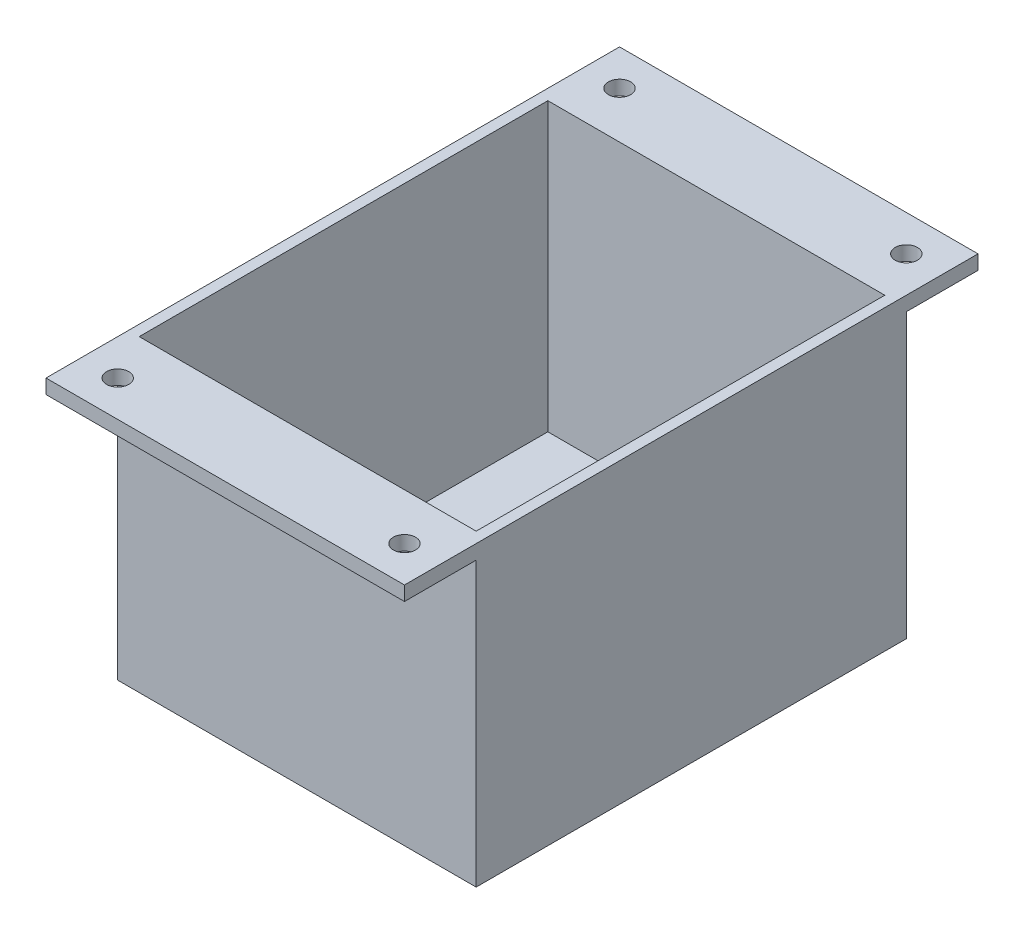
ISO-10303-21;
HEADER;
FILE_DESCRIPTION(('STEP AP214'),'2;1');
FILE_NAME('part.step','',(''),(''),'','','');
FILE_SCHEMA(('AUTOMOTIVE_DESIGN { 1 0 10303 214 1 1 1 1 }'));
ENDSEC;
DATA;
#1=APPLICATION_CONTEXT('core data for automotive mechanical design processes');
#2=APPLICATION_PROTOCOL_DEFINITION('international standard','automotive_design',2000,#1);
#3=PRODUCT_CONTEXT('',#1,'mechanical');
#4=PRODUCT('Part','Part','',(#3));
#5=PRODUCT_RELATED_PRODUCT_CATEGORY('part','',(#4));
#6=PRODUCT_DEFINITION_FORMATION('','',#4);
#7=PRODUCT_DEFINITION_CONTEXT('part definition',#1,'design');
#8=PRODUCT_DEFINITION('design','',#6,#7);
#9=PRODUCT_DEFINITION_SHAPE('','',#8);
#10=(LENGTH_UNIT() NAMED_UNIT(*) SI_UNIT(.MILLI.,.METRE.));
#11=(NAMED_UNIT(*) PLANE_ANGLE_UNIT() SI_UNIT($,.RADIAN.));
#12=(NAMED_UNIT(*) SI_UNIT($,.STERADIAN.) SOLID_ANGLE_UNIT());
#13=UNCERTAINTY_MEASURE_WITH_UNIT(LENGTH_MEASURE(1.E-05),#10,'distance_accuracy_value','');
#14=(GEOMETRIC_REPRESENTATION_CONTEXT(3) GLOBAL_UNCERTAINTY_ASSIGNED_CONTEXT((#13)) GLOBAL_UNIT_ASSIGNED_CONTEXT((#10,
#11,#12)) REPRESENTATION_CONTEXT('',''));
#15=CARTESIAN_POINT('',(0.,0.,0.));
#16=DIRECTION('',(0.,0.,1.));
#17=DIRECTION('',(1.,0.,0.));
#18=AXIS2_PLACEMENT_3D('',#15,#16,#17);
#19=CARTESIAN_POINT('',(0.,40.,-30.));
#20=DIRECTION('',(0.,0.,-1.));
#21=DIRECTION('',(-1.,0.,0.));
#22=AXIS2_PLACEMENT_3D('',#19,#20,#21);
#23=PLANE('',#22);
#24=DIRECTION('',(0.,-1.,0.));
#25=VECTOR('',#24,1.);
#26=CARTESIAN_POINT('',(-25.,40.,-30.));
#27=LINE('',#26,#25);
#28=CARTESIAN_POINT('',(-25.,38.,-30.));
#29=VERTEX_POINT('',#28);
#30=CARTESIAN_POINT('',(-25.,-1.5,-30.));
#31=VERTEX_POINT('',#30);
#32=EDGE_CURVE('E11',#29,#31,#27,.T.);
#33=ORIENTED_EDGE('',*,*,#32,.F.);
#34=DIRECTION('',(1.,0.,0.));
#35=VECTOR('',#34,1.);
#36=CARTESIAN_POINT('',(-25.,38.,-30.));
#37=LINE('',#36,#35);
#38=CARTESIAN_POINT('',(25.,38.,-30.));
#39=VERTEX_POINT('',#38);
#40=EDGE_CURVE('E176',#29,#39,#37,.T.);
#41=ORIENTED_EDGE('',*,*,#40,.T.);
#42=DIRECTION('',(0.,-1.,0.));
#43=VECTOR('',#42,1.);
#44=CARTESIAN_POINT('',(25.,40.,-30.));
#45=LINE('',#44,#43);
#46=CARTESIAN_POINT('',(25.,-1.5,-30.));
#47=VERTEX_POINT('',#46);
#48=EDGE_CURVE('E246',#39,#47,#45,.T.);
#49=ORIENTED_EDGE('',*,*,#48,.T.);
#50=DIRECTION('',(1.,0.,0.));
#51=VECTOR('',#50,1.);
#52=CARTESIAN_POINT('',(-25.,-1.5,-30.));
#53=LINE('',#52,#51);
#54=EDGE_CURVE('E203',#31,#47,#53,.T.);
#55=ORIENTED_EDGE('',*,*,#54,.F.);
#56=EDGE_LOOP('',(#33,#41,#49,#55));
#57=FACE_BOUND('',#56,.T.);
#58=ADVANCED_FACE('F47',(#57),#23,.T.);
#59=CARTESIAN_POINT('',(0.,40.,30.));
#60=DIRECTION('',(0.,0.,-1.));
#61=DIRECTION('',(-1.,0.,0.));
#62=AXIS2_PLACEMENT_3D('',#59,#60,#61);
#63=PLANE('',#62);
#64=DIRECTION('',(1.,0.,0.));
#65=VECTOR('',#64,1.);
#66=CARTESIAN_POINT('',(-25.,38.,30.));
#67=LINE('',#66,#65);
#68=CARTESIAN_POINT('',(-25.,38.,30.));
#69=VERTEX_POINT('',#68);
#70=CARTESIAN_POINT('',(25.,38.,30.));
#71=VERTEX_POINT('',#70);
#72=EDGE_CURVE('E73',#69,#71,#67,.T.);
#73=ORIENTED_EDGE('',*,*,#72,.F.);
#74=DIRECTION('',(0.,-1.,0.));
#75=VECTOR('',#74,1.);
#76=CARTESIAN_POINT('',(-25.,40.,30.));
#77=LINE('',#76,#75);
#78=CARTESIAN_POINT('',(-25.,-1.5,30.));
#79=VERTEX_POINT('',#78);
#80=EDGE_CURVE('E57',#69,#79,#77,.T.);
#81=ORIENTED_EDGE('',*,*,#80,.T.);
#82=DIRECTION('',(-1.,0.,0.));
#83=VECTOR('',#82,1.);
#84=CARTESIAN_POINT('',(-25.,-1.5,30.));
#85=LINE('',#84,#83);
#86=CARTESIAN_POINT('',(25.,-1.5,30.));
#87=VERTEX_POINT('',#86);
#88=EDGE_CURVE('E211',#87,#79,#85,.T.);
#89=ORIENTED_EDGE('',*,*,#88,.F.);
#90=DIRECTION('',(0.,-1.,0.));
#91=VECTOR('',#90,1.);
#92=CARTESIAN_POINT('',(25.,40.,30.));
#93=LINE('',#92,#91);
#94=EDGE_CURVE('E249',#71,#87,#93,.T.);
#95=ORIENTED_EDGE('',*,*,#94,.F.);
#96=EDGE_LOOP('',(#73,#81,#89,#95));
#97=FACE_BOUND('',#96,.T.);
#98=ADVANCED_FACE('F303',(#97),#63,.F.);
#99=CARTESIAN_POINT('',(-25.,40.,0.));
#100=DIRECTION('',(-1.,0.,0.));
#101=DIRECTION('',(0.,0.,1.));
#102=AXIS2_PLACEMENT_3D('',#99,#100,#101);
#103=PLANE('',#102);
#104=DIRECTION('',(0.,0.,-1.));
#105=VECTOR('',#104,1.);
#106=CARTESIAN_POINT('',(-25.,40.,0.));
#107=LINE('',#106,#105);
#108=CARTESIAN_POINT('',(-25.,40.,40.));
#109=VERTEX_POINT('',#108);
#110=CARTESIAN_POINT('',(-25.,40.,-40.));
#111=VERTEX_POINT('',#110);
#112=EDGE_CURVE('E151',#109,#111,#107,.T.);
#113=ORIENTED_EDGE('',*,*,#112,.T.);
#114=DIRECTION('',(0.,1.,0.));
#115=VECTOR('',#114,1.);
#116=CARTESIAN_POINT('',(-25.,40.,-40.));
#117=LINE('',#116,#115);
#118=CARTESIAN_POINT('',(-25.,38.,-40.));
#119=VERTEX_POINT('',#118);
#120=EDGE_CURVE('E158',#119,#111,#117,.T.);
#121=ORIENTED_EDGE('',*,*,#120,.F.);
#122=DIRECTION('',(0.,0.,-1.));
#123=VECTOR('',#122,1.);
#124=CARTESIAN_POINT('',(-25.,38.,-30.));
#125=LINE('',#124,#123);
#126=EDGE_CURVE('E165',#29,#119,#125,.T.);
#127=ORIENTED_EDGE('',*,*,#126,.F.);
#128=ORIENTED_EDGE('',*,*,#32,.T.);
#129=DIRECTION('',(0.,0.,-1.));
#130=VECTOR('',#129,1.);
#131=CARTESIAN_POINT('',(-25.,-1.5,30.));
#132=LINE('',#131,#130);
#133=EDGE_CURVE('E194',#79,#31,#132,.T.);
#134=ORIENTED_EDGE('',*,*,#133,.F.);
#135=ORIENTED_EDGE('',*,*,#80,.F.);
#136=DIRECTION('',(0.,0.,-1.));
#137=VECTOR('',#136,1.);
#138=CARTESIAN_POINT('',(-25.,38.,30.));
#139=LINE('',#138,#137);
#140=CARTESIAN_POINT('',(-25.,38.,40.));
#141=VERTEX_POINT('',#140);
#142=EDGE_CURVE('E182',#141,#69,#139,.T.);
#143=ORIENTED_EDGE('',*,*,#142,.F.);
#144=DIRECTION('',(0.,-1.,0.));
#145=VECTOR('',#144,1.);
#146=CARTESIAN_POINT('',(-25.,40.,40.));
#147=LINE('',#146,#145);
#148=EDGE_CURVE('E178',#109,#141,#147,.T.);
#149=ORIENTED_EDGE('',*,*,#148,.F.);
#150=EDGE_LOOP('',(#113,#121,#127,#128,#134,#135,#143,#149));
#151=FACE_BOUND('',#150,.T.);
#152=ADVANCED_FACE('F300',(#151),#103,.T.);
#153=CARTESIAN_POINT('',(23.5,40.,0.));
#154=DIRECTION('',(-1.,0.,0.));
#155=DIRECTION('',(0.,0.,1.));
#156=AXIS2_PLACEMENT_3D('',#153,#154,#155);
#157=PLANE('',#156);
#158=DIRECTION('',(0.,0.,-1.));
#159=VECTOR('',#158,1.);
#160=CARTESIAN_POINT('',(23.5,0.,0.));
#161=LINE('',#160,#159);
#162=CARTESIAN_POINT('',(23.5,0.,28.5));
#163=VERTEX_POINT('',#162);
#164=CARTESIAN_POINT('',(23.5,0.,-28.5));
#165=VERTEX_POINT('',#164);
#166=EDGE_CURVE('E215',#163,#165,#161,.T.);
#167=ORIENTED_EDGE('',*,*,#166,.F.);
#168=DIRECTION('',(0.,-1.,0.));
#169=VECTOR('',#168,1.);
#170=CARTESIAN_POINT('',(23.5,40.,28.5));
#171=LINE('',#170,#169);
#172=CARTESIAN_POINT('',(23.5,40.,28.5));
#173=VERTEX_POINT('',#172);
#174=EDGE_CURVE('E250',#173,#163,#171,.T.);
#175=ORIENTED_EDGE('',*,*,#174,.F.);
#176=DIRECTION('',(0.,0.,-1.));
#177=VECTOR('',#176,1.);
#178=CARTESIAN_POINT('',(23.5,40.,0.));
#179=LINE('',#178,#177);
#180=CARTESIAN_POINT('',(23.5,40.,-28.5));
#181=VERTEX_POINT('',#180);
#182=EDGE_CURVE('E216',#173,#181,#179,.T.);
#183=ORIENTED_EDGE('',*,*,#182,.T.);
#184=DIRECTION('',(0.,-1.,0.));
#185=VECTOR('',#184,1.);
#186=CARTESIAN_POINT('',(23.5,40.,-28.5));
#187=LINE('',#186,#185);
#188=EDGE_CURVE('E150',#181,#165,#187,.T.);
#189=ORIENTED_EDGE('',*,*,#188,.T.);
#190=EDGE_LOOP('',(#167,#175,#183,#189));
#191=FACE_BOUND('',#190,.T.);
#192=ADVANCED_FACE('F49',(#191),#157,.T.);
#193=CARTESIAN_POINT('',(0.,40.,28.5));
#194=DIRECTION('',(0.,0.,-1.));
#195=DIRECTION('',(-1.,0.,0.));
#196=AXIS2_PLACEMENT_3D('',#193,#194,#195);
#197=PLANE('',#196);
#198=DIRECTION('',(1.,0.,0.));
#199=VECTOR('',#198,1.);
#200=CARTESIAN_POINT('',(0.,0.,28.5));
#201=LINE('',#200,#199);
#202=CARTESIAN_POINT('',(-23.5,0.,28.5));
#203=VERTEX_POINT('',#202);
#204=EDGE_CURVE('E236',#203,#163,#201,.T.);
#205=ORIENTED_EDGE('',*,*,#204,.F.);
#206=DIRECTION('',(0.,-1.,0.));
#207=VECTOR('',#206,1.);
#208=CARTESIAN_POINT('',(-23.5,40.,28.5));
#209=LINE('',#208,#207);
#210=CARTESIAN_POINT('',(-23.5,40.,28.5));
#211=VERTEX_POINT('',#210);
#212=EDGE_CURVE('E261',#211,#203,#209,.T.);
#213=ORIENTED_EDGE('',*,*,#212,.F.);
#214=DIRECTION('',(1.,0.,0.));
#215=VECTOR('',#214,1.);
#216=CARTESIAN_POINT('',(0.,40.,28.5));
#217=LINE('',#216,#215);
#218=EDGE_CURVE('E220',#211,#173,#217,.T.);
#219=ORIENTED_EDGE('',*,*,#218,.T.);
#220=ORIENTED_EDGE('',*,*,#174,.T.);
#221=EDGE_LOOP('',(#205,#213,#219,#220));
#222=FACE_BOUND('',#221,.T.);
#223=ADVANCED_FACE('F345',(#222),#197,.T.);
#224=CARTESIAN_POINT('',(-23.5,40.,0.));
#225=DIRECTION('',(-1.,0.,0.));
#226=DIRECTION('',(0.,0.,1.));
#227=AXIS2_PLACEMENT_3D('',#224,#225,#226);
#228=PLANE('',#227);
#229=DIRECTION('',(0.,0.,-1.));
#230=VECTOR('',#229,1.);
#231=CARTESIAN_POINT('',(-23.5,0.,0.));
#232=LINE('',#231,#230);
#233=CARTESIAN_POINT('',(-23.5,0.,-28.5));
#234=VERTEX_POINT('',#233);
#235=EDGE_CURVE('E240',#203,#234,#232,.T.);
#236=ORIENTED_EDGE('',*,*,#235,.T.);
#237=DIRECTION('',(0.,-1.,0.));
#238=VECTOR('',#237,1.);
#239=CARTESIAN_POINT('',(-23.5,40.,-28.5));
#240=LINE('',#239,#238);
#241=CARTESIAN_POINT('',(-23.5,40.,-28.5));
#242=VERTEX_POINT('',#241);
#243=EDGE_CURVE('E257',#242,#234,#240,.T.);
#244=ORIENTED_EDGE('',*,*,#243,.F.);
#245=DIRECTION('',(0.,0.,-1.));
#246=VECTOR('',#245,1.);
#247=CARTESIAN_POINT('',(-23.5,40.,0.));
#248=LINE('',#247,#246);
#249=EDGE_CURVE('E225',#211,#242,#248,.T.);
#250=ORIENTED_EDGE('',*,*,#249,.F.);
#251=ORIENTED_EDGE('',*,*,#212,.T.);
#252=EDGE_LOOP('',(#236,#244,#250,#251));
#253=FACE_BOUND('',#252,.T.);
#254=ADVANCED_FACE('F350',(#253),#228,.F.);
#255=CARTESIAN_POINT('',(0.,40.,-28.5));
#256=DIRECTION('',(0.,0.,-1.));
#257=DIRECTION('',(-1.,0.,0.));
#258=AXIS2_PLACEMENT_3D('',#255,#256,#257);
#259=PLANE('',#258);
#260=DIRECTION('',(1.,0.,0.));
#261=VECTOR('',#260,1.);
#262=CARTESIAN_POINT('',(0.,0.,-28.5));
#263=LINE('',#262,#261);
#264=EDGE_CURVE('E221',#234,#165,#263,.T.);
#265=ORIENTED_EDGE('',*,*,#264,.T.);
#266=ORIENTED_EDGE('',*,*,#188,.F.);
#267=DIRECTION('',(1.,0.,0.));
#268=VECTOR('',#267,1.);
#269=CARTESIAN_POINT('',(0.,40.,-28.5));
#270=LINE('',#269,#268);
#271=EDGE_CURVE('E228',#242,#181,#270,.T.);
#272=ORIENTED_EDGE('',*,*,#271,.F.);
#273=ORIENTED_EDGE('',*,*,#243,.T.);
#274=EDGE_LOOP('',(#265,#266,#272,#273));
#275=FACE_BOUND('',#274,.T.);
#276=ADVANCED_FACE('F353',(#275),#259,.F.);
#277=CARTESIAN_POINT('',(25.,40.,0.));
#278=DIRECTION('',(-1.,0.,0.));
#279=DIRECTION('',(0.,0.,1.));
#280=AXIS2_PLACEMENT_3D('',#277,#278,#279);
#281=PLANE('',#280);
#282=DIRECTION('',(0.,0.,-1.));
#283=VECTOR('',#282,1.);
#284=CARTESIAN_POINT('',(25.,40.,0.));
#285=LINE('',#284,#283);
#286=CARTESIAN_POINT('',(25.,40.,40.));
#287=VERTEX_POINT('',#286);
#288=CARTESIAN_POINT('',(25.,40.,-40.));
#289=VERTEX_POINT('',#288);
#290=EDGE_CURVE('E138',#287,#289,#285,.T.);
#291=ORIENTED_EDGE('',*,*,#290,.F.);
#292=DIRECTION('',(0.,-1.,0.));
#293=VECTOR('',#292,1.);
#294=CARTESIAN_POINT('',(25.,40.,40.));
#295=LINE('',#294,#293);
#296=CARTESIAN_POINT('',(25.,38.,40.));
#297=VERTEX_POINT('',#296);
#298=EDGE_CURVE('E169',#287,#297,#295,.T.);
#299=ORIENTED_EDGE('',*,*,#298,.T.);
#300=DIRECTION('',(0.,0.,-1.));
#301=VECTOR('',#300,1.);
#302=CARTESIAN_POINT('',(25.,38.,30.));
#303=LINE('',#302,#301);
#304=EDGE_CURVE('E183',#297,#71,#303,.T.);
#305=ORIENTED_EDGE('',*,*,#304,.T.);
#306=ORIENTED_EDGE('',*,*,#94,.T.);
#307=DIRECTION('',(0.,0.,1.));
#308=VECTOR('',#307,1.);
#309=CARTESIAN_POINT('',(25.,-1.5,30.));
#310=LINE('',#309,#308);
#311=EDGE_CURVE('E207',#47,#87,#310,.T.);
#312=ORIENTED_EDGE('',*,*,#311,.F.);
#313=ORIENTED_EDGE('',*,*,#48,.F.);
#314=DIRECTION('',(0.,0.,-1.));
#315=VECTOR('',#314,1.);
#316=CARTESIAN_POINT('',(25.,38.,-30.));
#317=LINE('',#316,#315);
#318=CARTESIAN_POINT('',(25.,38.,-40.));
#319=VERTEX_POINT('',#318);
#320=EDGE_CURVE('E65',#39,#319,#317,.T.);
#321=ORIENTED_EDGE('',*,*,#320,.T.);
#322=DIRECTION('',(0.,1.,0.));
#323=VECTOR('',#322,1.);
#324=CARTESIAN_POINT('',(25.,40.,-40.));
#325=LINE('',#324,#323);
#326=EDGE_CURVE('E156',#319,#289,#325,.T.);
#327=ORIENTED_EDGE('',*,*,#326,.T.);
#328=EDGE_LOOP('',(#291,#299,#305,#306,#312,#313,#321,#327));
#329=FACE_BOUND('',#328,.T.);
#330=ADVANCED_FACE('F162',(#329),#281,.F.);
#331=CARTESIAN_POINT('',(0.,40.,0.));
#332=DIRECTION('',(0.,1.,0.));
#333=DIRECTION('',(0.,0.,1.));
#334=AXIS2_PLACEMENT_3D('',#331,#332,#333);
#335=PLANE('',#334);
#336=CARTESIAN_POINT('',(-20.,40.,35.));
#337=DIRECTION('',(0.,1.,0.));
#338=DIRECTION('',(0.,0.,1.));
#339=AXIS2_PLACEMENT_3D('',#336,#337,#338);
#340=CIRCLE('',#339,1.55);
#341=CARTESIAN_POINT('',(-20.,40.,36.55));
#342=VERTEX_POINT('',#341);
#343=EDGE_CURVE('E317',#342,#342,#340,.T.);
#344=ORIENTED_EDGE('',*,*,#343,.F.);
#345=EDGE_LOOP('',(#344));
#346=FACE_BOUND('',#345,.T.);
#347=CARTESIAN_POINT('',(20.,40.,35.));
#348=DIRECTION('',(0.,1.,0.));
#349=DIRECTION('',(0.,0.,1.));
#350=AXIS2_PLACEMENT_3D('',#347,#348,#349);
#351=CIRCLE('',#350,1.55);
#352=CARTESIAN_POINT('',(20.,40.,36.55));
#353=VERTEX_POINT('',#352);
#354=EDGE_CURVE('E321',#353,#353,#351,.T.);
#355=ORIENTED_EDGE('',*,*,#354,.F.);
#356=EDGE_LOOP('',(#355));
#357=FACE_BOUND('',#356,.T.);
#358=CARTESIAN_POINT('',(20.,40.,-35.));
#359=DIRECTION('',(0.,1.,0.));
#360=DIRECTION('',(0.,0.,1.));
#361=AXIS2_PLACEMENT_3D('',#358,#359,#360);
#362=CIRCLE('',#361,1.55);
#363=CARTESIAN_POINT('',(20.,40.,-33.45));
#364=VERTEX_POINT('',#363);
#365=EDGE_CURVE('E316',#364,#364,#362,.T.);
#366=ORIENTED_EDGE('',*,*,#365,.F.);
#367=EDGE_LOOP('',(#366));
#368=FACE_BOUND('',#367,.T.);
#369=CARTESIAN_POINT('',(-20.,40.,-35.));
#370=DIRECTION('',(0.,1.,0.));
#371=DIRECTION('',(0.,0.,1.));
#372=AXIS2_PLACEMENT_3D('',#369,#370,#371);
#373=CIRCLE('',#372,1.55);
#374=CARTESIAN_POINT('',(-20.,40.,-33.45));
#375=VERTEX_POINT('',#374);
#376=EDGE_CURVE('E272',#375,#375,#373,.T.);
#377=ORIENTED_EDGE('',*,*,#376,.F.);
#378=EDGE_LOOP('',(#377));
#379=FACE_BOUND('',#378,.T.);
#380=ORIENTED_EDGE('',*,*,#182,.F.);
#381=ORIENTED_EDGE('',*,*,#218,.F.);
#382=ORIENTED_EDGE('',*,*,#249,.T.);
#383=ORIENTED_EDGE('',*,*,#271,.T.);
#384=EDGE_LOOP('',(#380,#381,#382,#383));
#385=FACE_BOUND('',#384,.T.);
#386=ORIENTED_EDGE('',*,*,#290,.T.);
#387=DIRECTION('',(1.,0.,0.));
#388=VECTOR('',#387,1.);
#389=CARTESIAN_POINT('',(-25.,40.,-40.));
#390=LINE('',#389,#388);
#391=EDGE_CURVE('E141',#111,#289,#390,.T.);
#392=ORIENTED_EDGE('',*,*,#391,.F.);
#393=ORIENTED_EDGE('',*,*,#112,.F.);
#394=DIRECTION('',(1.,0.,0.));
#395=VECTOR('',#394,1.);
#396=CARTESIAN_POINT('',(-25.,40.,40.));
#397=LINE('',#396,#395);
#398=EDGE_CURVE('E144',#109,#287,#397,.T.);
#399=ORIENTED_EDGE('',*,*,#398,.T.);
#400=EDGE_LOOP('',(#386,#392,#393,#399));
#401=FACE_BOUND('',#400,.T.);
#402=ADVANCED_FACE('F140',(#346,#357,#368,#379,#385,#401),#335,.T.);
#403=CARTESIAN_POINT('',(0.,0.,0.));
#404=DIRECTION('',(0.,-1.,0.));
#405=DIRECTION('',(0.,0.,-1.));
#406=AXIS2_PLACEMENT_3D('',#403,#404,#405);
#407=PLANE('',#406);
#408=ORIENTED_EDGE('',*,*,#204,.T.);
#409=ORIENTED_EDGE('',*,*,#166,.T.);
#410=ORIENTED_EDGE('',*,*,#264,.F.);
#411=ORIENTED_EDGE('',*,*,#235,.F.);
#412=EDGE_LOOP('',(#408,#409,#410,#411));
#413=FACE_BOUND('',#412,.T.);
#414=ADVANCED_FACE('F333',(#413),#407,.F.);
#415=CARTESIAN_POINT('',(0.,-1.5,0.));
#416=DIRECTION('',(0.,-1.,0.));
#417=DIRECTION('',(0.,0.,-1.));
#418=AXIS2_PLACEMENT_3D('',#415,#416,#417);
#419=PLANE('',#418);
#420=ORIENTED_EDGE('',*,*,#133,.T.);
#421=ORIENTED_EDGE('',*,*,#54,.T.);
#422=ORIENTED_EDGE('',*,*,#311,.T.);
#423=ORIENTED_EDGE('',*,*,#88,.T.);
#424=EDGE_LOOP('',(#420,#421,#422,#423));
#425=FACE_BOUND('',#424,.T.);
#426=ADVANCED_FACE('F291',(#425),#419,.T.);
#427=CARTESIAN_POINT('',(-25.,38.,30.));
#428=DIRECTION('',(0.,-1.,0.));
#429=DIRECTION('',(0.,0.,-1.));
#430=AXIS2_PLACEMENT_3D('',#427,#428,#429);
#431=PLANE('',#430);
#432=CARTESIAN_POINT('',(-20.,38.,35.));
#433=DIRECTION('',(0.,-1.,0.));
#434=DIRECTION('',(0.,0.,-1.));
#435=AXIS2_PLACEMENT_3D('',#432,#433,#434);
#436=CIRCLE('',#435,1.55);
#437=CARTESIAN_POINT('',(-20.,38.,33.45));
#438=VERTEX_POINT('',#437);
#439=EDGE_CURVE('E51',#438,#438,#436,.T.);
#440=ORIENTED_EDGE('',*,*,#439,.F.);
#441=EDGE_LOOP('',(#440));
#442=FACE_BOUND('',#441,.T.);
#443=CARTESIAN_POINT('',(20.,38.,35.));
#444=DIRECTION('',(0.,-1.,0.));
#445=DIRECTION('',(0.,0.,-1.));
#446=AXIS2_PLACEMENT_3D('',#443,#444,#445);
#447=CIRCLE('',#446,1.55);
#448=CARTESIAN_POINT('',(20.,38.,33.45));
#449=VERTEX_POINT('',#448);
#450=EDGE_CURVE('E275',#449,#449,#447,.T.);
#451=ORIENTED_EDGE('',*,*,#450,.F.);
#452=EDGE_LOOP('',(#451));
#453=FACE_BOUND('',#452,.T.);
#454=ORIENTED_EDGE('',*,*,#304,.F.);
#455=DIRECTION('',(1.,0.,0.));
#456=VECTOR('',#455,1.);
#457=CARTESIAN_POINT('',(-25.,38.,40.));
#458=LINE('',#457,#456);
#459=EDGE_CURVE('E195',#141,#297,#458,.T.);
#460=ORIENTED_EDGE('',*,*,#459,.F.);
#461=ORIENTED_EDGE('',*,*,#142,.T.);
#462=ORIENTED_EDGE('',*,*,#72,.T.);
#463=EDGE_LOOP('',(#454,#460,#461,#462));
#464=FACE_BOUND('',#463,.T.);
#465=ADVANCED_FACE('F287',(#442,#453,#464),#431,.T.);
#466=CARTESIAN_POINT('',(-25.,40.,40.));
#467=DIRECTION('',(0.,0.,1.));
#468=DIRECTION('',(1.,0.,0.));
#469=AXIS2_PLACEMENT_3D('',#466,#467,#468);
#470=PLANE('',#469);
#471=ORIENTED_EDGE('',*,*,#298,.F.);
#472=ORIENTED_EDGE('',*,*,#398,.F.);
#473=ORIENTED_EDGE('',*,*,#148,.T.);
#474=ORIENTED_EDGE('',*,*,#459,.T.);
#475=EDGE_LOOP('',(#471,#472,#473,#474));
#476=FACE_BOUND('',#475,.T.);
#477=ADVANCED_FACE('F290',(#476),#470,.T.);
#478=CARTESIAN_POINT('',(-25.,40.,-40.));
#479=DIRECTION('',(0.,0.,-1.));
#480=DIRECTION('',(-1.,0.,0.));
#481=AXIS2_PLACEMENT_3D('',#478,#479,#480);
#482=PLANE('',#481);
#483=ORIENTED_EDGE('',*,*,#326,.F.);
#484=DIRECTION('',(1.,0.,0.));
#485=VECTOR('',#484,1.);
#486=CARTESIAN_POINT('',(-25.,38.,-40.));
#487=LINE('',#486,#485);
#488=EDGE_CURVE('E160',#119,#319,#487,.T.);
#489=ORIENTED_EDGE('',*,*,#488,.F.);
#490=ORIENTED_EDGE('',*,*,#120,.T.);
#491=ORIENTED_EDGE('',*,*,#391,.T.);
#492=EDGE_LOOP('',(#483,#489,#490,#491));
#493=FACE_BOUND('',#492,.T.);
#494=ADVANCED_FACE('F155',(#493),#482,.T.);
#495=CARTESIAN_POINT('',(-25.,38.,-30.));
#496=DIRECTION('',(0.,-1.,0.));
#497=DIRECTION('',(0.,0.,-1.));
#498=AXIS2_PLACEMENT_3D('',#495,#496,#497);
#499=PLANE('',#498);
#500=CARTESIAN_POINT('',(20.,38.,-35.));
#501=DIRECTION('',(0.,-1.,0.));
#502=DIRECTION('',(0.,0.,-1.));
#503=AXIS2_PLACEMENT_3D('',#500,#501,#502);
#504=CIRCLE('',#503,1.55);
#505=CARTESIAN_POINT('',(20.,38.,-36.55));
#506=VERTEX_POINT('',#505);
#507=EDGE_CURVE('E271',#506,#506,#504,.T.);
#508=ORIENTED_EDGE('',*,*,#507,.F.);
#509=EDGE_LOOP('',(#508));
#510=FACE_BOUND('',#509,.T.);
#511=CARTESIAN_POINT('',(-20.,38.,-35.));
#512=DIRECTION('',(0.,-1.,0.));
#513=DIRECTION('',(0.,0.,-1.));
#514=AXIS2_PLACEMENT_3D('',#511,#512,#513);
#515=CIRCLE('',#514,1.55);
#516=CARTESIAN_POINT('',(-20.,38.,-36.55));
#517=VERTEX_POINT('',#516);
#518=EDGE_CURVE('E267',#517,#517,#515,.T.);
#519=ORIENTED_EDGE('',*,*,#518,.F.);
#520=EDGE_LOOP('',(#519));
#521=FACE_BOUND('',#520,.T.);
#522=ORIENTED_EDGE('',*,*,#320,.F.);
#523=ORIENTED_EDGE('',*,*,#40,.F.);
#524=ORIENTED_EDGE('',*,*,#126,.T.);
#525=ORIENTED_EDGE('',*,*,#488,.T.);
#526=EDGE_LOOP('',(#522,#523,#524,#525));
#527=FACE_BOUND('',#526,.T.);
#528=ADVANCED_FACE('F405',(#510,#521,#527),#499,.T.);
#529=CARTESIAN_POINT('',(-20.,37.,-35.));
#530=DIRECTION('',(0.,1.,0.));
#531=DIRECTION('',(0.,0.,1.));
#532=AXIS2_PLACEMENT_3D('',#529,#530,#531);
#533=CYLINDRICAL_SURFACE('',#532,1.55);
#534=ORIENTED_EDGE('',*,*,#518,.T.);
#535=EDGE_LOOP('',(#534));
#536=FACE_BOUND('',#535,.T.);
#537=ORIENTED_EDGE('',*,*,#376,.T.);
#538=EDGE_LOOP('',(#537));
#539=FACE_BOUND('',#538,.T.);
#540=ADVANCED_FACE('F422',(#536,#539),#533,.F.);
#541=CARTESIAN_POINT('',(20.,37.,-35.));
#542=DIRECTION('',(0.,1.,0.));
#543=DIRECTION('',(0.,0.,1.));
#544=AXIS2_PLACEMENT_3D('',#541,#542,#543);
#545=CYLINDRICAL_SURFACE('',#544,1.55);
#546=ORIENTED_EDGE('',*,*,#507,.T.);
#547=EDGE_LOOP('',(#546));
#548=FACE_BOUND('',#547,.T.);
#549=ORIENTED_EDGE('',*,*,#365,.T.);
#550=EDGE_LOOP('',(#549));
#551=FACE_BOUND('',#550,.T.);
#552=ADVANCED_FACE('F329',(#548,#551),#545,.F.);
#553=CARTESIAN_POINT('',(20.,37.,35.));
#554=DIRECTION('',(0.,1.,0.));
#555=DIRECTION('',(0.,0.,1.));
#556=AXIS2_PLACEMENT_3D('',#553,#554,#555);
#557=CYLINDRICAL_SURFACE('',#556,1.55);
#558=ORIENTED_EDGE('',*,*,#450,.T.);
#559=EDGE_LOOP('',(#558));
#560=FACE_BOUND('',#559,.T.);
#561=ORIENTED_EDGE('',*,*,#354,.T.);
#562=EDGE_LOOP('',(#561));
#563=FACE_BOUND('',#562,.T.);
#564=ADVANCED_FACE('F439',(#560,#563),#557,.F.);
#565=CARTESIAN_POINT('',(-20.,37.,35.));
#566=DIRECTION('',(0.,1.,0.));
#567=DIRECTION('',(0.,0.,1.));
#568=AXIS2_PLACEMENT_3D('',#565,#566,#567);
#569=CYLINDRICAL_SURFACE('',#568,1.55);
#570=ORIENTED_EDGE('',*,*,#439,.T.);
#571=EDGE_LOOP('',(#570));
#572=FACE_BOUND('',#571,.T.);
#573=ORIENTED_EDGE('',*,*,#343,.T.);
#574=EDGE_LOOP('',(#573));
#575=FACE_BOUND('',#574,.T.);
#576=ADVANCED_FACE('F284',(#572,#575),#569,.F.);
#577=CLOSED_SHELL('',(#58,#98,#152,#192,#223,#254,#276,#330,#402,#414,#426,#465,#477,#494,#528,
#540,#552,#564,#576));
#578=MANIFOLD_SOLID_BREP('B2',#577);
#579=ADVANCED_BREP_SHAPE_REPRESENTATION('',(#18,#578),#14);
#580=SHAPE_DEFINITION_REPRESENTATION(#9,#579);
ENDSEC;
END-ISO-10303-21;
